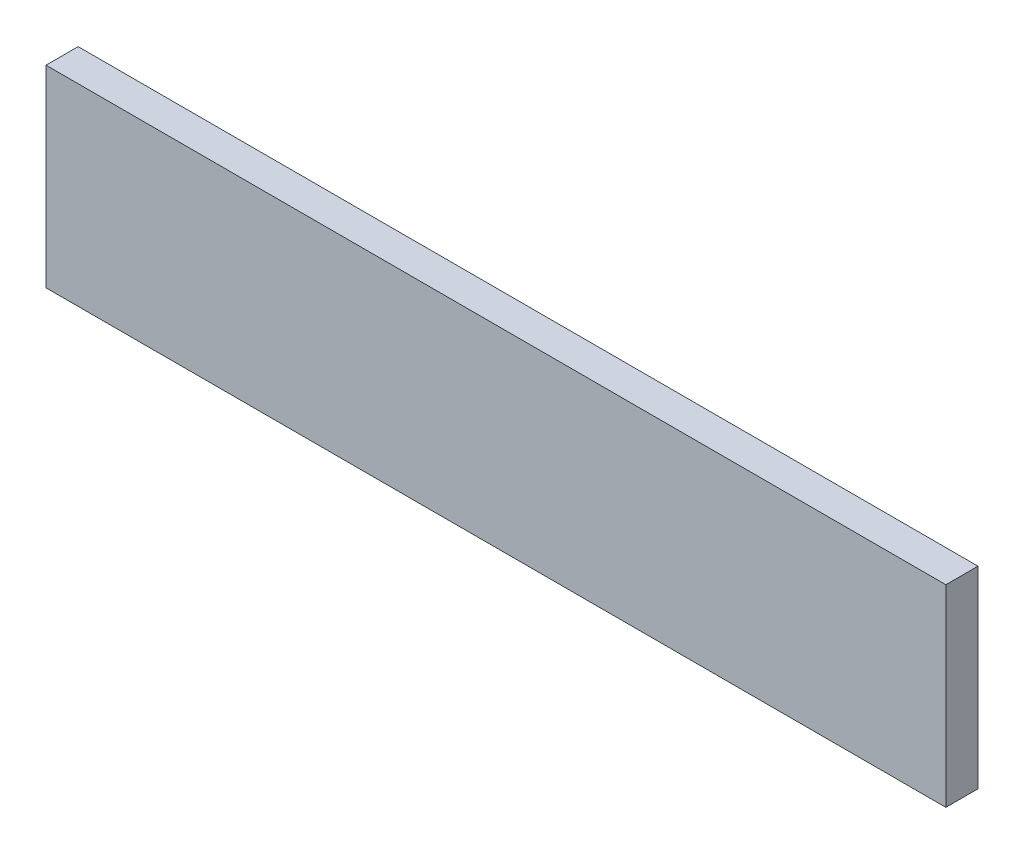
ISO-10303-21;
HEADER;
FILE_DESCRIPTION(('STEP AP214'),'2;1');
FILE_NAME('part.step','',(''),(''),'','','');
FILE_SCHEMA(('AUTOMOTIVE_DESIGN { 1 0 10303 214 1 1 1 1 }'));
ENDSEC;
DATA;
#1=APPLICATION_CONTEXT('core data for automotive mechanical design processes');
#2=APPLICATION_PROTOCOL_DEFINITION('international standard','automotive_design',2000,#1);
#3=PRODUCT_CONTEXT('',#1,'mechanical');
#4=PRODUCT('Part','Part','',(#3));
#5=PRODUCT_RELATED_PRODUCT_CATEGORY('part','',(#4));
#6=PRODUCT_DEFINITION_FORMATION('','',#4);
#7=PRODUCT_DEFINITION_CONTEXT('part definition',#1,'design');
#8=PRODUCT_DEFINITION('design','',#6,#7);
#9=PRODUCT_DEFINITION_SHAPE('','',#8);
#10=(LENGTH_UNIT() NAMED_UNIT(*) SI_UNIT(.MILLI.,.METRE.));
#11=(NAMED_UNIT(*) PLANE_ANGLE_UNIT() SI_UNIT($,.RADIAN.));
#12=(NAMED_UNIT(*) SI_UNIT($,.STERADIAN.) SOLID_ANGLE_UNIT());
#13=UNCERTAINTY_MEASURE_WITH_UNIT(LENGTH_MEASURE(1.E-05),#10,'distance_accuracy_value','');
#14=(GEOMETRIC_REPRESENTATION_CONTEXT(3) GLOBAL_UNCERTAINTY_ASSIGNED_CONTEXT((#13)) GLOBAL_UNIT_ASSIGNED_CONTEXT((#10,
#11,#12)) REPRESENTATION_CONTEXT('',''));
#15=CARTESIAN_POINT('',(0.,0.,0.));
#16=DIRECTION('',(0.,0.,1.));
#17=DIRECTION('',(1.,0.,0.));
#18=AXIS2_PLACEMENT_3D('',#15,#16,#17);
#19=CARTESIAN_POINT('',(42.,-9.,3.));
#20=DIRECTION('',(-1.,0.,0.));
#21=DIRECTION('',(0.,0.,1.));
#22=AXIS2_PLACEMENT_3D('',#19,#20,#21);
#23=PLANE('',#22);
#24=DIRECTION('',(0.,1.,0.));
#25=VECTOR('',#24,1.);
#26=CARTESIAN_POINT('',(42.,-9.,0.));
#27=LINE('',#26,#25);
#28=CARTESIAN_POINT('',(42.,-9.,0.));
#29=VERTEX_POINT('',#28);
#30=CARTESIAN_POINT('',(42.,9.,0.));
#31=VERTEX_POINT('',#30);
#32=EDGE_CURVE('E109',#29,#31,#27,.T.);
#33=ORIENTED_EDGE('',*,*,#32,.T.);
#34=DIRECTION('',(0.,0.,-1.));
#35=VECTOR('',#34,1.);
#36=CARTESIAN_POINT('',(42.,9.,3.));
#37=LINE('',#36,#35);
#38=CARTESIAN_POINT('',(42.,9.,3.));
#39=VERTEX_POINT('',#38);
#40=EDGE_CURVE('E11',#39,#31,#37,.T.);
#41=ORIENTED_EDGE('',*,*,#40,.F.);
#42=DIRECTION('',(0.,1.,0.));
#43=VECTOR('',#42,1.);
#44=CARTESIAN_POINT('',(42.,-9.,3.));
#45=LINE('',#44,#43);
#46=CARTESIAN_POINT('',(42.,-9.,3.));
#47=VERTEX_POINT('',#46);
#48=EDGE_CURVE('E93',#47,#39,#45,.T.);
#49=ORIENTED_EDGE('',*,*,#48,.F.);
#50=DIRECTION('',(0.,0.,-1.));
#51=VECTOR('',#50,1.);
#52=CARTESIAN_POINT('',(42.,-9.,3.));
#53=LINE('',#52,#51);
#54=EDGE_CURVE('E105',#47,#29,#53,.T.);
#55=ORIENTED_EDGE('',*,*,#54,.T.);
#56=EDGE_LOOP('',(#33,#41,#49,#55));
#57=FACE_BOUND('',#56,.T.);
#58=ADVANCED_FACE('F41',(#57),#23,.F.);
#59=CARTESIAN_POINT('',(-42.,9.,3.));
#60=DIRECTION('',(0.,-1.,0.));
#61=DIRECTION('',(0.,0.,-1.));
#62=AXIS2_PLACEMENT_3D('',#59,#60,#61);
#63=PLANE('',#62);
#64=DIRECTION('',(-1.,0.,0.));
#65=VECTOR('',#64,1.);
#66=CARTESIAN_POINT('',(-42.,9.,0.));
#67=LINE('',#66,#65);
#68=CARTESIAN_POINT('',(-42.,9.,0.));
#69=VERTEX_POINT('',#68);
#70=EDGE_CURVE('E98',#31,#69,#67,.T.);
#71=ORIENTED_EDGE('',*,*,#70,.T.);
#72=DIRECTION('',(0.,0.,-1.));
#73=VECTOR('',#72,1.);
#74=CARTESIAN_POINT('',(-42.,9.,3.));
#75=LINE('',#74,#73);
#76=CARTESIAN_POINT('',(-42.,9.,3.));
#77=VERTEX_POINT('',#76);
#78=EDGE_CURVE('E50',#77,#69,#75,.T.);
#79=ORIENTED_EDGE('',*,*,#78,.F.);
#80=DIRECTION('',(-1.,0.,0.));
#81=VECTOR('',#80,1.);
#82=CARTESIAN_POINT('',(-42.,9.,3.));
#83=LINE('',#82,#81);
#84=EDGE_CURVE('E88',#39,#77,#83,.T.);
#85=ORIENTED_EDGE('',*,*,#84,.F.);
#86=ORIENTED_EDGE('',*,*,#40,.T.);
#87=EDGE_LOOP('',(#71,#79,#85,#86));
#88=FACE_BOUND('',#87,.T.);
#89=ADVANCED_FACE('F97',(#88),#63,.F.);
#90=CARTESIAN_POINT('',(-42.,-9.,3.));
#91=DIRECTION('',(1.,0.,0.));
#92=DIRECTION('',(0.,0.,-1.));
#93=AXIS2_PLACEMENT_3D('',#90,#91,#92);
#94=PLANE('',#93);
#95=DIRECTION('',(0.,-1.,0.));
#96=VECTOR('',#95,1.);
#97=CARTESIAN_POINT('',(-42.,-9.,0.));
#98=LINE('',#97,#96);
#99=CARTESIAN_POINT('',(-42.,-9.,0.));
#100=VERTEX_POINT('',#99);
#101=EDGE_CURVE('E75',#69,#100,#98,.T.);
#102=ORIENTED_EDGE('',*,*,#101,.T.);
#103=DIRECTION('',(0.,0.,-1.));
#104=VECTOR('',#103,1.);
#105=CARTESIAN_POINT('',(-42.,-9.,3.));
#106=LINE('',#105,#104);
#107=CARTESIAN_POINT('',(-42.,-9.,3.));
#108=VERTEX_POINT('',#107);
#109=EDGE_CURVE('E100',#108,#100,#106,.T.);
#110=ORIENTED_EDGE('',*,*,#109,.F.);
#111=DIRECTION('',(0.,-1.,0.));
#112=VECTOR('',#111,1.);
#113=CARTESIAN_POINT('',(-42.,-9.,3.));
#114=LINE('',#113,#112);
#115=EDGE_CURVE('E91',#77,#108,#114,.T.);
#116=ORIENTED_EDGE('',*,*,#115,.F.);
#117=ORIENTED_EDGE('',*,*,#78,.T.);
#118=EDGE_LOOP('',(#102,#110,#116,#117));
#119=FACE_BOUND('',#118,.T.);
#120=ADVANCED_FACE('F101',(#119),#94,.F.);
#121=CARTESIAN_POINT('',(-42.,-9.,3.));
#122=DIRECTION('',(0.,1.,0.));
#123=DIRECTION('',(0.,0.,1.));
#124=AXIS2_PLACEMENT_3D('',#121,#122,#123);
#125=PLANE('',#124);
#126=DIRECTION('',(1.,0.,0.));
#127=VECTOR('',#126,1.);
#128=CARTESIAN_POINT('',(-42.,-9.,0.));
#129=LINE('',#128,#127);
#130=EDGE_CURVE('E81',#100,#29,#129,.T.);
#131=ORIENTED_EDGE('',*,*,#130,.T.);
#132=ORIENTED_EDGE('',*,*,#54,.F.);
#133=DIRECTION('',(1.,0.,0.));
#134=VECTOR('',#133,1.);
#135=CARTESIAN_POINT('',(-42.,-9.,3.));
#136=LINE('',#135,#134);
#137=EDGE_CURVE('E58',#108,#47,#136,.T.);
#138=ORIENTED_EDGE('',*,*,#137,.F.);
#139=ORIENTED_EDGE('',*,*,#109,.T.);
#140=EDGE_LOOP('',(#131,#132,#138,#139));
#141=FACE_BOUND('',#140,.T.);
#142=ADVANCED_FACE('F122',(#141),#125,.F.);
#143=CARTESIAN_POINT('',(0.,0.,3.));
#144=DIRECTION('',(0.,0.,-1.));
#145=DIRECTION('',(-1.,0.,0.));
#146=AXIS2_PLACEMENT_3D('',#143,#144,#145);
#147=PLANE('',#146);
#148=ORIENTED_EDGE('',*,*,#48,.T.);
#149=ORIENTED_EDGE('',*,*,#84,.T.);
#150=ORIENTED_EDGE('',*,*,#115,.T.);
#151=ORIENTED_EDGE('',*,*,#137,.T.);
#152=EDGE_LOOP('',(#148,#149,#150,#151));
#153=FACE_BOUND('',#152,.T.);
#154=ADVANCED_FACE('F89',(#153),#147,.F.);
#155=CARTESIAN_POINT('',(0.,0.,0.));
#156=DIRECTION('',(0.,0.,-1.));
#157=DIRECTION('',(-1.,0.,0.));
#158=AXIS2_PLACEMENT_3D('',#155,#156,#157);
#159=PLANE('',#158);
#160=ORIENTED_EDGE('',*,*,#32,.F.);
#161=ORIENTED_EDGE('',*,*,#130,.F.);
#162=ORIENTED_EDGE('',*,*,#101,.F.);
#163=ORIENTED_EDGE('',*,*,#70,.F.);
#164=EDGE_LOOP('',(#160,#161,#162,#163));
#165=FACE_BOUND('',#164,.T.);
#166=ADVANCED_FACE('F125',(#165),#159,.T.);
#167=CLOSED_SHELL('',(#58,#89,#120,#142,#154,#166));
#168=MANIFOLD_SOLID_BREP('B2',#167);
#169=ADVANCED_BREP_SHAPE_REPRESENTATION('',(#18,#168),#14);
#170=SHAPE_DEFINITION_REPRESENTATION(#9,#169);
ENDSEC;
END-ISO-10303-21;
